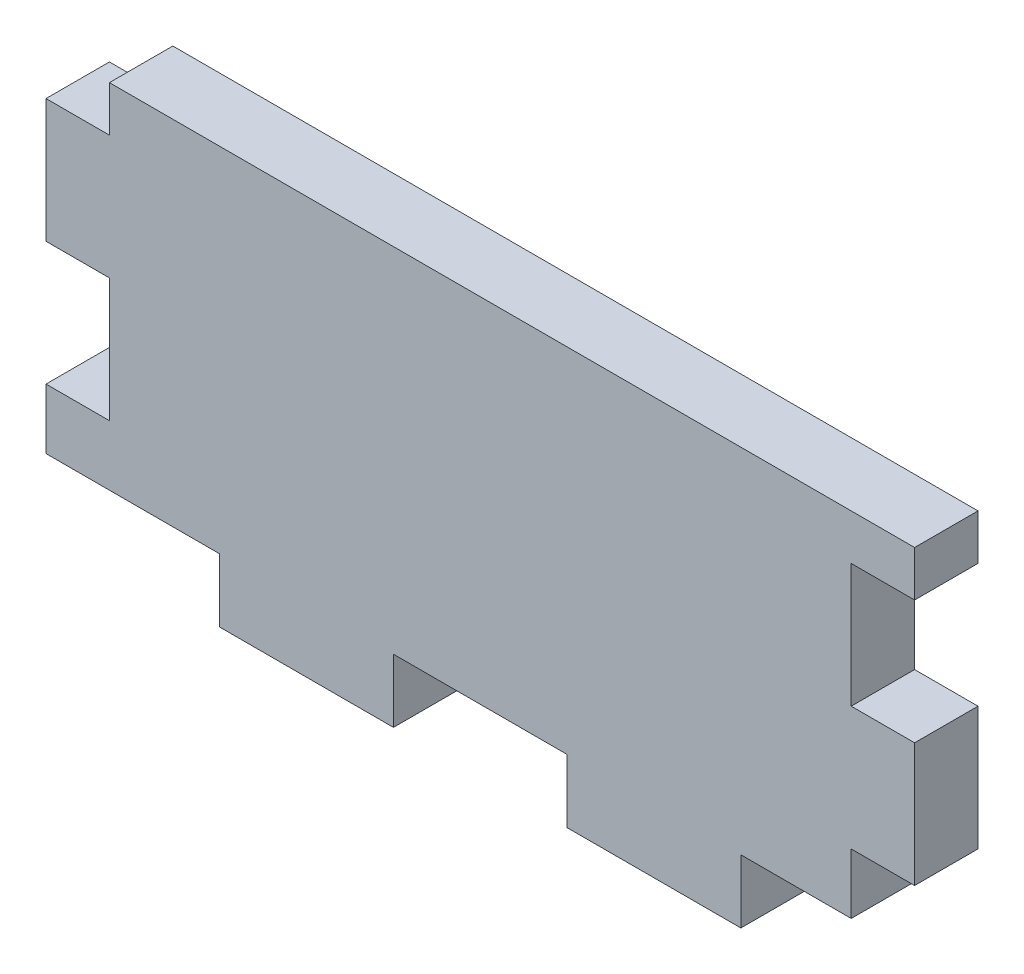
ISO-10303-21;
HEADER;
FILE_DESCRIPTION(('STEP AP214'),'2;1');
FILE_NAME('part.step','',(''),(''),'','','');
FILE_SCHEMA(('AUTOMOTIVE_DESIGN { 1 0 10303 214 1 1 1 1 }'));
ENDSEC;
DATA;
#1=APPLICATION_CONTEXT('core data for automotive mechanical design processes');
#2=APPLICATION_PROTOCOL_DEFINITION('international standard','automotive_design',2000,#1);
#3=PRODUCT_CONTEXT('',#1,'mechanical');
#4=PRODUCT('Part','Part','',(#3));
#5=PRODUCT_RELATED_PRODUCT_CATEGORY('part','',(#4));
#6=PRODUCT_DEFINITION_FORMATION('','',#4);
#7=PRODUCT_DEFINITION_CONTEXT('part definition',#1,'design');
#8=PRODUCT_DEFINITION('design','',#6,#7);
#9=PRODUCT_DEFINITION_SHAPE('','',#8);
#10=(LENGTH_UNIT() NAMED_UNIT(*) SI_UNIT(.MILLI.,.METRE.));
#11=(NAMED_UNIT(*) PLANE_ANGLE_UNIT() SI_UNIT($,.RADIAN.));
#12=(NAMED_UNIT(*) SI_UNIT($,.STERADIAN.) SOLID_ANGLE_UNIT());
#13=UNCERTAINTY_MEASURE_WITH_UNIT(LENGTH_MEASURE(1.E-05),#10,'distance_accuracy_value','');
#14=(GEOMETRIC_REPRESENTATION_CONTEXT(3) GLOBAL_UNCERTAINTY_ASSIGNED_CONTEXT((#13)) GLOBAL_UNIT_ASSIGNED_CONTEXT((#10,
#11,#12)) REPRESENTATION_CONTEXT('',''));
#15=CARTESIAN_POINT('',(0.,0.,0.));
#16=DIRECTION('',(0.,0.,1.));
#17=DIRECTION('',(1.,0.,0.));
#18=AXIS2_PLACEMENT_3D('',#15,#16,#17);
#19=CARTESIAN_POINT('',(0.,-26.67,4.5593));
#20=DIRECTION('',(0.,1.,0.));
#21=DIRECTION('',(-1.,0.,0.));
#22=AXIS2_PLACEMENT_3D('',#19,#20,#21);
#23=PLANE('',#22);
#24=DIRECTION('',(0.,0.,1.));
#25=VECTOR('',#24,1.);
#26=CARTESIAN_POINT('',(18.73758,-26.67,-26.67));
#27=LINE('',#26,#25);
#28=CARTESIAN_POINT('',(18.73758,-26.67,0.));
#29=VERTEX_POINT('',#28);
#30=CARTESIAN_POINT('',(18.73758,-26.67,4.55929999999996));
#31=VERTEX_POINT('',#30);
#32=EDGE_CURVE('E366',#29,#31,#27,.T.);
#33=ORIENTED_EDGE('',*,*,#32,.T.);
#34=DIRECTION('',(1.,0.,0.));
#35=VECTOR('',#34,1.);
#36=CARTESIAN_POINT('',(0.,-26.67,4.5593));
#37=LINE('',#36,#35);
#38=CARTESIAN_POINT('',(6.24586000000003,-26.67,4.55929999999997));
#39=VERTEX_POINT('',#38);
#40=EDGE_CURVE('E217',#39,#31,#37,.T.);
#41=ORIENTED_EDGE('',*,*,#40,.F.);
#42=DIRECTION('',(0.,0.,1.));
#43=VECTOR('',#42,1.);
#44=CARTESIAN_POINT('',(6.24586000000003,-26.67,-26.67));
#45=LINE('',#44,#43);
#46=CARTESIAN_POINT('',(6.24586000000003,-26.67,0.));
#47=VERTEX_POINT('',#46);
#48=EDGE_CURVE('E201',#47,#39,#45,.T.);
#49=ORIENTED_EDGE('',*,*,#48,.F.);
#50=DIRECTION('',(1.,0.,0.));
#51=VECTOR('',#50,1.);
#52=CARTESIAN_POINT('',(0.,-26.67,0.));
#53=LINE('',#52,#51);
#54=EDGE_CURVE('E288',#47,#29,#53,.T.);
#55=ORIENTED_EDGE('',*,*,#54,.T.);
#56=EDGE_LOOP('',(#33,#41,#49,#55));
#57=FACE_BOUND('',#56,.T.);
#58=ADVANCED_FACE('F34',(#57),#23,.F.);
#59=CARTESIAN_POINT('',(-18.73758,-26.67,4.55929999999997));
#60=VERTEX_POINT('',#59);
#61=CARTESIAN_POINT('',(-6.24585999999997,-26.67,4.55929999999997));
#62=VERTEX_POINT('',#61);
#63=EDGE_CURVE('E252',#60,#62,#37,.T.);
#64=ORIENTED_EDGE('',*,*,#63,.F.);
#65=DIRECTION('',(0.,0.,1.));
#66=VECTOR('',#65,1.);
#67=CARTESIAN_POINT('',(-18.73758,-26.67,-26.67));
#68=LINE('',#67,#66);
#69=CARTESIAN_POINT('',(-18.73758,-26.67,0.));
#70=VERTEX_POINT('',#69);
#71=EDGE_CURVE('E368',#70,#60,#68,.T.);
#72=ORIENTED_EDGE('',*,*,#71,.F.);
#73=CARTESIAN_POINT('',(-6.24585999999997,-26.67,0.));
#74=VERTEX_POINT('',#73);
#75=EDGE_CURVE('E291',#70,#74,#53,.T.);
#76=ORIENTED_EDGE('',*,*,#75,.T.);
#77=DIRECTION('',(0.,0.,1.));
#78=VECTOR('',#77,1.);
#79=CARTESIAN_POINT('',(-6.24585999999997,-26.67,-26.67));
#80=LINE('',#79,#78);
#81=EDGE_CURVE('E370',#74,#62,#80,.T.);
#82=ORIENTED_EDGE('',*,*,#81,.T.);
#83=EDGE_LOOP('',(#64,#72,#76,#82));
#84=FACE_BOUND('',#83,.T.);
#85=ADVANCED_FACE('F385',(#84),#23,.F.);
#86=CARTESIAN_POINT('',(0.,0.,4.5593));
#87=DIRECTION('',(0.,0.,1.));
#88=DIRECTION('',(1.,0.,0.));
#89=AXIS2_PLACEMENT_3D('',#86,#87,#88);
#90=PLANE('',#89);
#91=ORIENTED_EDGE('',*,*,#40,.T.);
#92=DIRECTION('',(0.,-1.,0.));
#93=VECTOR('',#92,1.);
#94=CARTESIAN_POINT('',(18.73758,-22.1107,4.55929999999996));
#95=LINE('',#94,#93);
#96=CARTESIAN_POINT('',(18.73758,-22.1107,4.55929999999996));
#97=VERTEX_POINT('',#96);
#98=EDGE_CURVE('E197',#97,#31,#95,.T.);
#99=ORIENTED_EDGE('',*,*,#98,.F.);
#100=DIRECTION('',(1.,0.,0.));
#101=VECTOR('',#100,1.);
#102=CARTESIAN_POINT('',(0.,-22.1107,4.55929999999997));
#103=LINE('',#102,#101);
#104=CARTESIAN_POINT('',(26.67,-22.1107,4.55929999999996));
#105=VERTEX_POINT('',#104);
#106=EDGE_CURVE('E200',#97,#105,#103,.T.);
#107=ORIENTED_EDGE('',*,*,#106,.T.);
#108=DIRECTION('',(0.,1.,0.));
#109=VECTOR('',#108,1.);
#110=CARTESIAN_POINT('',(26.6700000000001,0.,4.5593));
#111=LINE('',#110,#109);
#112=CARTESIAN_POINT('',(26.6700000000001,-17.78,4.5593));
#113=VERTEX_POINT('',#112);
#114=EDGE_CURVE('E253',#105,#113,#111,.T.);
#115=ORIENTED_EDGE('',*,*,#114,.T.);
#116=DIRECTION('',(-1.,0.,0.));
#117=VECTOR('',#116,1.);
#118=CARTESIAN_POINT('',(0.,-17.7800000000001,4.5593));
#119=LINE('',#118,#117);
#120=CARTESIAN_POINT('',(31.2293,-17.78,4.5593));
#121=VERTEX_POINT('',#120);
#122=EDGE_CURVE('E255',#121,#113,#119,.T.);
#123=ORIENTED_EDGE('',*,*,#122,.F.);
#124=DIRECTION('',(0.,1.,0.));
#125=VECTOR('',#124,1.);
#126=CARTESIAN_POINT('',(31.2293,0.,4.5593));
#127=LINE('',#126,#125);
#128=CARTESIAN_POINT('',(31.2293,-8.89000000000001,4.5593));
#129=VERTEX_POINT('',#128);
#130=EDGE_CURVE('E233',#121,#129,#127,.T.);
#131=ORIENTED_EDGE('',*,*,#130,.T.);
#132=DIRECTION('',(1.,0.,0.));
#133=VECTOR('',#132,1.);
#134=CARTESIAN_POINT('',(0.,-8.89000000000014,4.5593));
#135=LINE('',#134,#133);
#136=CARTESIAN_POINT('',(26.67,-8.89000000000002,4.5593));
#137=VERTEX_POINT('',#136);
#138=EDGE_CURVE('E258',#137,#129,#135,.T.);
#139=ORIENTED_EDGE('',*,*,#138,.F.);
#140=DIRECTION('',(0.,1.,0.));
#141=VECTOR('',#140,1.);
#142=CARTESIAN_POINT('',(26.67,1.76941794549637E-13,4.5593));
#143=LINE('',#142,#141);
#144=CARTESIAN_POINT('',(26.67,-1.84500891137916E-13,4.5593));
#145=VERTEX_POINT('',#144);
#146=EDGE_CURVE('E261',#137,#145,#143,.T.);
#147=ORIENTED_EDGE('',*,*,#146,.T.);
#148=DIRECTION('',(1.,0.,0.));
#149=VECTOR('',#148,1.);
#150=CARTESIAN_POINT('',(0.,-1.25479590885709E-12,4.5593));
#151=LINE('',#150,#149);
#152=CARTESIAN_POINT('',(31.2293,0.,4.5593));
#153=VERTEX_POINT('',#152);
#154=EDGE_CURVE('E263',#145,#153,#151,.T.);
#155=ORIENTED_EDGE('',*,*,#154,.T.);
#156=CARTESIAN_POINT('',(31.2293,3.27151999999999,4.5593));
#157=VERTEX_POINT('',#156);
#158=EDGE_CURVE('E228',#153,#157,#127,.T.);
#159=ORIENTED_EDGE('',*,*,#158,.T.);
#160=DIRECTION('',(-1.,0.,0.));
#161=VECTOR('',#160,1.);
#162=CARTESIAN_POINT('',(0.,3.27151999999999,4.5593));
#163=LINE('',#162,#161);
#164=CARTESIAN_POINT('',(-26.67,3.27151999999999,4.5593));
#165=VERTEX_POINT('',#164);
#166=EDGE_CURVE('E231',#157,#165,#163,.T.);
#167=ORIENTED_EDGE('',*,*,#166,.T.);
#168=DIRECTION('',(0.,-1.,0.));
#169=VECTOR('',#168,1.);
#170=CARTESIAN_POINT('',(-26.67,0.,4.5593));
#171=LINE('',#170,#169);
#172=CARTESIAN_POINT('',(-26.67,0.,4.5593));
#173=VERTEX_POINT('',#172);
#174=EDGE_CURVE('E235',#165,#173,#171,.T.);
#175=ORIENTED_EDGE('',*,*,#174,.T.);
#176=DIRECTION('',(-1.,0.,0.));
#177=VECTOR('',#176,1.);
#178=CARTESIAN_POINT('',(0.,0.,4.5593));
#179=LINE('',#178,#177);
#180=CARTESIAN_POINT('',(-31.2293,0.,4.5593));
#181=VERTEX_POINT('',#180);
#182=EDGE_CURVE('E237',#173,#181,#179,.T.);
#183=ORIENTED_EDGE('',*,*,#182,.T.);
#184=DIRECTION('',(0.,1.,0.));
#185=VECTOR('',#184,1.);
#186=CARTESIAN_POINT('',(-31.2293,0.,4.5593));
#187=LINE('',#186,#185);
#188=CARTESIAN_POINT('',(-31.2293,-8.89,4.5593));
#189=VERTEX_POINT('',#188);
#190=EDGE_CURVE('E239',#189,#181,#187,.T.);
#191=ORIENTED_EDGE('',*,*,#190,.F.);
#192=DIRECTION('',(-1.,0.,0.));
#193=VECTOR('',#192,1.);
#194=CARTESIAN_POINT('',(0.,-8.88999999999989,4.5593));
#195=LINE('',#194,#193);
#196=CARTESIAN_POINT('',(-26.67,-8.88999999999999,4.5593));
#197=VERTEX_POINT('',#196);
#198=EDGE_CURVE('E242',#197,#189,#195,.T.);
#199=ORIENTED_EDGE('',*,*,#198,.F.);
#200=DIRECTION('',(0.,-1.,0.));
#201=VECTOR('',#200,1.);
#202=CARTESIAN_POINT('',(-26.67,0.,4.5593));
#203=LINE('',#202,#201);
#204=CARTESIAN_POINT('',(-26.67,-17.78,4.5593));
#205=VERTEX_POINT('',#204);
#206=EDGE_CURVE('E246',#197,#205,#203,.T.);
#207=ORIENTED_EDGE('',*,*,#206,.T.);
#208=DIRECTION('',(-1.,0.,0.));
#209=VECTOR('',#208,1.);
#210=CARTESIAN_POINT('',(0.,-17.7799999999999,4.5593));
#211=LINE('',#210,#209);
#212=CARTESIAN_POINT('',(-31.2293,-17.78,4.5593));
#213=VERTEX_POINT('',#212);
#214=EDGE_CURVE('E248',#205,#213,#211,.T.);
#215=ORIENTED_EDGE('',*,*,#214,.T.);
#216=CARTESIAN_POINT('',(-31.2293,-22.1107,4.55929999999997));
#217=VERTEX_POINT('',#216);
#218=EDGE_CURVE('E243',#217,#213,#187,.T.);
#219=ORIENTED_EDGE('',*,*,#218,.F.);
#220=CARTESIAN_POINT('',(-18.73758,-22.1107,4.55929999999997));
#221=VERTEX_POINT('',#220);
#222=EDGE_CURVE('E212',#217,#221,#103,.T.);
#223=ORIENTED_EDGE('',*,*,#222,.T.);
#224=DIRECTION('',(0.,-1.,0.));
#225=VECTOR('',#224,1.);
#226=CARTESIAN_POINT('',(-18.73758,-22.1107,4.55929999999997));
#227=LINE('',#226,#225);
#228=EDGE_CURVE('E218',#221,#60,#227,.T.);
#229=ORIENTED_EDGE('',*,*,#228,.T.);
#230=ORIENTED_EDGE('',*,*,#63,.T.);
#231=DIRECTION('',(0.,-1.,0.));
#232=VECTOR('',#231,1.);
#233=CARTESIAN_POINT('',(-6.24585999999997,-22.1107,4.55929999999997));
#234=LINE('',#233,#232);
#235=CARTESIAN_POINT('',(-6.24585999999997,-22.1107,4.55929999999997));
#236=VERTEX_POINT('',#235);
#237=EDGE_CURVE('E375',#236,#62,#234,.T.);
#238=ORIENTED_EDGE('',*,*,#237,.F.);
#239=CARTESIAN_POINT('',(6.24586000000003,-22.1107,4.55929999999997));
#240=VERTEX_POINT('',#239);
#241=EDGE_CURVE('E211',#236,#240,#103,.T.);
#242=ORIENTED_EDGE('',*,*,#241,.T.);
#243=DIRECTION('',(0.,-1.,0.));
#244=VECTOR('',#243,1.);
#245=CARTESIAN_POINT('',(6.24586000000003,-22.1107,4.55929999999997));
#246=LINE('',#245,#244);
#247=EDGE_CURVE('E360',#240,#39,#246,.T.);
#248=ORIENTED_EDGE('',*,*,#247,.T.);
#249=EDGE_LOOP('',(#91,#99,#107,#115,#123,#131,#139,#147,#155,#159,#167,#175,#183,#191,#199,
#207,#215,#219,#223,#229,#230,#238,#242,#248));
#250=FACE_BOUND('',#249,.T.);
#251=ADVANCED_FACE('F214',(#250),#90,.T.);
#252=CARTESIAN_POINT('',(31.2293,0.,4.5593));
#253=DIRECTION('',(-1.,0.,0.));
#254=DIRECTION('',(0.,0.,1.));
#255=AXIS2_PLACEMENT_3D('',#252,#253,#254);
#256=PLANE('',#255);
#257=DIRECTION('',(0.,1.,0.));
#258=VECTOR('',#257,1.);
#259=CARTESIAN_POINT('',(31.2293,0.,0.));
#260=LINE('',#259,#258);
#261=CARTESIAN_POINT('',(31.2293,0.,0.));
#262=VERTEX_POINT('',#261);
#263=CARTESIAN_POINT('',(31.2293,3.27151999999999,0.));
#264=VERTEX_POINT('',#263);
#265=EDGE_CURVE('E227',#262,#264,#260,.T.);
#266=ORIENTED_EDGE('',*,*,#265,.T.);
#267=DIRECTION('',(0.,0.,-1.));
#268=VECTOR('',#267,1.);
#269=CARTESIAN_POINT('',(31.2293,3.27151999999999,4.5593));
#270=LINE('',#269,#268);
#271=EDGE_CURVE('E334',#157,#264,#270,.T.);
#272=ORIENTED_EDGE('',*,*,#271,.F.);
#273=ORIENTED_EDGE('',*,*,#158,.F.);
#274=DIRECTION('',(0.,0.,-1.));
#275=VECTOR('',#274,1.);
#276=CARTESIAN_POINT('',(31.2293,0.,4.5593));
#277=LINE('',#276,#275);
#278=EDGE_CURVE('E265',#153,#262,#277,.T.);
#279=ORIENTED_EDGE('',*,*,#278,.T.);
#280=EDGE_LOOP('',(#266,#272,#273,#279));
#281=FACE_BOUND('',#280,.T.);
#282=ADVANCED_FACE('F428',(#281),#256,.F.);
#283=CARTESIAN_POINT('',(0.,3.27151999999999,4.5593));
#284=DIRECTION('',(0.,-1.,0.));
#285=DIRECTION('',(1.,0.,0.));
#286=AXIS2_PLACEMENT_3D('',#283,#284,#285);
#287=PLANE('',#286);
#288=DIRECTION('',(-1.,0.,0.));
#289=VECTOR('',#288,1.);
#290=CARTESIAN_POINT('',(0.,3.27151999999999,0.));
#291=LINE('',#290,#289);
#292=CARTESIAN_POINT('',(-26.67,3.27151999999999,0.));
#293=VERTEX_POINT('',#292);
#294=EDGE_CURVE('E268',#264,#293,#291,.T.);
#295=ORIENTED_EDGE('',*,*,#294,.T.);
#296=DIRECTION('',(0.,0.,-1.));
#297=VECTOR('',#296,1.);
#298=CARTESIAN_POINT('',(-26.67,3.27151999999999,4.5593));
#299=LINE('',#298,#297);
#300=EDGE_CURVE('E332',#165,#293,#299,.T.);
#301=ORIENTED_EDGE('',*,*,#300,.F.);
#302=ORIENTED_EDGE('',*,*,#166,.F.);
#303=ORIENTED_EDGE('',*,*,#271,.T.);
#304=EDGE_LOOP('',(#295,#301,#302,#303));
#305=FACE_BOUND('',#304,.T.);
#306=ADVANCED_FACE('F36',(#305),#287,.F.);
#307=CARTESIAN_POINT('',(-26.67,0.,4.5593));
#308=DIRECTION('',(1.,0.,0.));
#309=DIRECTION('',(0.,1.,0.));
#310=AXIS2_PLACEMENT_3D('',#307,#308,#309);
#311=PLANE('',#310);
#312=DIRECTION('',(0.,-1.,0.));
#313=VECTOR('',#312,1.);
#314=CARTESIAN_POINT('',(-26.67,0.,0.));
#315=LINE('',#314,#313);
#316=CARTESIAN_POINT('',(-26.67,0.,0.));
#317=VERTEX_POINT('',#316);
#318=EDGE_CURVE('E271',#293,#317,#315,.T.);
#319=ORIENTED_EDGE('',*,*,#318,.T.);
#320=DIRECTION('',(0.,0.,-1.));
#321=VECTOR('',#320,1.);
#322=CARTESIAN_POINT('',(-26.67,0.,4.5593));
#323=LINE('',#322,#321);
#324=EDGE_CURVE('E329',#173,#317,#323,.T.);
#325=ORIENTED_EDGE('',*,*,#324,.F.);
#326=ORIENTED_EDGE('',*,*,#174,.F.);
#327=ORIENTED_EDGE('',*,*,#300,.T.);
#328=EDGE_LOOP('',(#319,#325,#326,#327));
#329=FACE_BOUND('',#328,.T.);
#330=ADVANCED_FACE('F422',(#329),#311,.F.);
#331=CARTESIAN_POINT('',(0.,0.,4.5593));
#332=DIRECTION('',(0.,-1.,0.));
#333=DIRECTION('',(1.,0.,0.));
#334=AXIS2_PLACEMENT_3D('',#331,#332,#333);
#335=PLANE('',#334);
#336=DIRECTION('',(-1.,0.,0.));
#337=VECTOR('',#336,1.);
#338=CARTESIAN_POINT('',(0.,0.,0.));
#339=LINE('',#338,#337);
#340=CARTESIAN_POINT('',(-31.2293,0.,0.));
#341=VERTEX_POINT('',#340);
#342=EDGE_CURVE('E273',#317,#341,#339,.T.);
#343=ORIENTED_EDGE('',*,*,#342,.T.);
#344=DIRECTION('',(0.,0.,-1.));
#345=VECTOR('',#344,1.);
#346=CARTESIAN_POINT('',(-31.2293,0.,4.5593));
#347=LINE('',#346,#345);
#348=EDGE_CURVE('E327',#181,#341,#347,.T.);
#349=ORIENTED_EDGE('',*,*,#348,.F.);
#350=ORIENTED_EDGE('',*,*,#182,.F.);
#351=ORIENTED_EDGE('',*,*,#324,.T.);
#352=EDGE_LOOP('',(#343,#349,#350,#351));
#353=FACE_BOUND('',#352,.T.);
#354=ADVANCED_FACE('F417',(#353),#335,.F.);
#355=CARTESIAN_POINT('',(-31.2293,0.,4.5593));
#356=DIRECTION('',(-1.,0.,0.));
#357=DIRECTION('',(0.,-1.,0.));
#358=AXIS2_PLACEMENT_3D('',#355,#356,#357);
#359=PLANE('',#358);
#360=DIRECTION('',(0.,1.,0.));
#361=VECTOR('',#360,1.);
#362=CARTESIAN_POINT('',(-31.2293,0.,0.));
#363=LINE('',#362,#361);
#364=CARTESIAN_POINT('',(-31.2293,-8.89,0.));
#365=VERTEX_POINT('',#364);
#366=EDGE_CURVE('E276',#365,#341,#363,.T.);
#367=ORIENTED_EDGE('',*,*,#366,.F.);
#368=DIRECTION('',(0.,0.,-1.));
#369=VECTOR('',#368,1.);
#370=CARTESIAN_POINT('',(-31.2293,-8.89,4.5593));
#371=LINE('',#370,#369);
#372=EDGE_CURVE('E325',#189,#365,#371,.T.);
#373=ORIENTED_EDGE('',*,*,#372,.F.);
#374=ORIENTED_EDGE('',*,*,#190,.T.);
#375=ORIENTED_EDGE('',*,*,#348,.T.);
#376=EDGE_LOOP('',(#367,#373,#374,#375));
#377=FACE_BOUND('',#376,.T.);
#378=ADVANCED_FACE('F412',(#377),#359,.T.);
#379=CARTESIAN_POINT('',(0.,-8.88999999999989,4.5593));
#380=DIRECTION('',(0.,-1.,0.));
#381=DIRECTION('',(1.,0.,0.));
#382=AXIS2_PLACEMENT_3D('',#379,#380,#381);
#383=PLANE('',#382);
#384=DIRECTION('',(-1.,0.,0.));
#385=VECTOR('',#384,1.);
#386=CARTESIAN_POINT('',(0.,-8.88999999999989,0.));
#387=LINE('',#386,#385);
#388=CARTESIAN_POINT('',(-26.67,-8.88999999999999,0.));
#389=VERTEX_POINT('',#388);
#390=EDGE_CURVE('E279',#389,#365,#387,.T.);
#391=ORIENTED_EDGE('',*,*,#390,.F.);
#392=DIRECTION('',(0.,0.,-1.));
#393=VECTOR('',#392,1.);
#394=CARTESIAN_POINT('',(-26.67,-8.88999999999999,4.5593));
#395=LINE('',#394,#393);
#396=EDGE_CURVE('E323',#197,#389,#395,.T.);
#397=ORIENTED_EDGE('',*,*,#396,.F.);
#398=ORIENTED_EDGE('',*,*,#198,.T.);
#399=ORIENTED_EDGE('',*,*,#372,.T.);
#400=EDGE_LOOP('',(#391,#397,#398,#399));
#401=FACE_BOUND('',#400,.T.);
#402=ADVANCED_FACE('F408',(#401),#383,.T.);
#403=CARTESIAN_POINT('',(-26.67,0.,4.5593));
#404=DIRECTION('',(1.,0.,0.));
#405=DIRECTION('',(0.,1.,0.));
#406=AXIS2_PLACEMENT_3D('',#403,#404,#405);
#407=PLANE('',#406);
#408=DIRECTION('',(0.,-1.,0.));
#409=VECTOR('',#408,1.);
#410=CARTESIAN_POINT('',(-26.67,0.,0.));
#411=LINE('',#410,#409);
#412=CARTESIAN_POINT('',(-26.67,-17.78,0.));
#413=VERTEX_POINT('',#412);
#414=EDGE_CURVE('E283',#389,#413,#411,.T.);
#415=ORIENTED_EDGE('',*,*,#414,.T.);
#416=DIRECTION('',(0.,0.,-1.));
#417=VECTOR('',#416,1.);
#418=CARTESIAN_POINT('',(-26.67,-17.78,4.5593));
#419=LINE('',#418,#417);
#420=EDGE_CURVE('E320',#205,#413,#419,.T.);
#421=ORIENTED_EDGE('',*,*,#420,.F.);
#422=ORIENTED_EDGE('',*,*,#206,.F.);
#423=ORIENTED_EDGE('',*,*,#396,.T.);
#424=EDGE_LOOP('',(#415,#421,#422,#423));
#425=FACE_BOUND('',#424,.T.);
#426=ADVANCED_FACE('F468',(#425),#407,.F.);
#427=CARTESIAN_POINT('',(0.,-17.7799999999999,4.5593));
#428=DIRECTION('',(0.,-1.,0.));
#429=DIRECTION('',(1.,0.,0.));
#430=AXIS2_PLACEMENT_3D('',#427,#428,#429);
#431=PLANE('',#430);
#432=DIRECTION('',(-1.,0.,0.));
#433=VECTOR('',#432,1.);
#434=CARTESIAN_POINT('',(0.,-17.7799999999999,0.));
#435=LINE('',#434,#433);
#436=CARTESIAN_POINT('',(-31.2293,-17.78,0.));
#437=VERTEX_POINT('',#436);
#438=EDGE_CURVE('E285',#413,#437,#435,.T.);
#439=ORIENTED_EDGE('',*,*,#438,.T.);
#440=DIRECTION('',(0.,0.,-1.));
#441=VECTOR('',#440,1.);
#442=CARTESIAN_POINT('',(-31.2293,-17.78,4.5593));
#443=LINE('',#442,#441);
#444=EDGE_CURVE('E317',#213,#437,#443,.T.);
#445=ORIENTED_EDGE('',*,*,#444,.F.);
#446=ORIENTED_EDGE('',*,*,#214,.F.);
#447=ORIENTED_EDGE('',*,*,#420,.T.);
#448=EDGE_LOOP('',(#439,#445,#446,#447));
#449=FACE_BOUND('',#448,.T.);
#450=ADVANCED_FACE('F402',(#449),#431,.F.);
#451=DIRECTION('',(0.,0.,-1.));
#452=VECTOR('',#451,1.);
#453=CARTESIAN_POINT('',(-31.2293,-22.1107,-26.67));
#454=LINE('',#453,#452);
#455=CARTESIAN_POINT('',(-31.2293,-22.1107,0.));
#456=VERTEX_POINT('',#455);
#457=EDGE_CURVE('E209',#217,#456,#454,.T.);
#458=ORIENTED_EDGE('',*,*,#457,.F.);
#459=ORIENTED_EDGE('',*,*,#218,.T.);
#460=ORIENTED_EDGE('',*,*,#444,.T.);
#461=EDGE_CURVE('E280',#456,#437,#363,.T.);
#462=ORIENTED_EDGE('',*,*,#461,.F.);
#463=EDGE_LOOP('',(#458,#459,#460,#462));
#464=FACE_BOUND('',#463,.T.);
#465=ADVANCED_FACE('F395',(#464),#359,.T.);
#466=CARTESIAN_POINT('',(26.6700000000001,0.,4.5593));
#467=DIRECTION('',(-1.,0.,0.));
#468=DIRECTION('',(0.,-1.,0.));
#469=AXIS2_PLACEMENT_3D('',#466,#467,#468);
#470=PLANE('',#469);
#471=ORIENTED_EDGE('',*,*,#114,.F.);
#472=DIRECTION('',(0.,0.,-1.));
#473=VECTOR('',#472,1.);
#474=CARTESIAN_POINT('',(26.67,-22.1107,4.5593));
#475=LINE('',#474,#473);
#476=CARTESIAN_POINT('',(26.67,-22.1107,0.));
#477=VERTEX_POINT('',#476);
#478=EDGE_CURVE('E206',#105,#477,#475,.T.);
#479=ORIENTED_EDGE('',*,*,#478,.T.);
#480=DIRECTION('',(0.,1.,0.));
#481=VECTOR('',#480,1.);
#482=CARTESIAN_POINT('',(26.6700000000001,0.,0.));
#483=LINE('',#482,#481);
#484=CARTESIAN_POINT('',(26.6700000000001,-17.78,0.));
#485=VERTEX_POINT('',#484);
#486=EDGE_CURVE('E292',#477,#485,#483,.T.);
#487=ORIENTED_EDGE('',*,*,#486,.T.);
#488=DIRECTION('',(0.,0.,-1.));
#489=VECTOR('',#488,1.);
#490=CARTESIAN_POINT('',(26.6700000000001,-17.78,4.5593));
#491=LINE('',#490,#489);
#492=EDGE_CURVE('E314',#113,#485,#491,.T.);
#493=ORIENTED_EDGE('',*,*,#492,.F.);
#494=EDGE_LOOP('',(#471,#479,#487,#493));
#495=FACE_BOUND('',#494,.T.);
#496=ADVANCED_FACE('F454',(#495),#470,.F.);
#497=CARTESIAN_POINT('',(0.,-17.7800000000001,4.5593));
#498=DIRECTION('',(0.,-1.,0.));
#499=DIRECTION('',(1.,0.,0.));
#500=AXIS2_PLACEMENT_3D('',#497,#498,#499);
#501=PLANE('',#500);
#502=DIRECTION('',(-1.,0.,0.));
#503=VECTOR('',#502,1.);
#504=CARTESIAN_POINT('',(0.,-17.7800000000001,0.));
#505=LINE('',#504,#503);
#506=CARTESIAN_POINT('',(31.2293,-17.78,0.));
#507=VERTEX_POINT('',#506);
#508=EDGE_CURVE('E294',#507,#485,#505,.T.);
#509=ORIENTED_EDGE('',*,*,#508,.F.);
#510=DIRECTION('',(0.,0.,-1.));
#511=VECTOR('',#510,1.);
#512=CARTESIAN_POINT('',(31.2293,-17.78,4.5593));
#513=LINE('',#512,#511);
#514=EDGE_CURVE('E312',#121,#507,#513,.T.);
#515=ORIENTED_EDGE('',*,*,#514,.F.);
#516=ORIENTED_EDGE('',*,*,#122,.T.);
#517=ORIENTED_EDGE('',*,*,#492,.T.);
#518=EDGE_LOOP('',(#509,#515,#516,#517));
#519=FACE_BOUND('',#518,.T.);
#520=ADVANCED_FACE('F450',(#519),#501,.T.);
#521=CARTESIAN_POINT('',(31.2293,-8.89000000000001,0.));
#522=VERTEX_POINT('',#521);
#523=EDGE_CURVE('E269',#507,#522,#260,.T.);
#524=ORIENTED_EDGE('',*,*,#523,.T.);
#525=DIRECTION('',(0.,0.,-1.));
#526=VECTOR('',#525,1.);
#527=CARTESIAN_POINT('',(31.2293,-8.89000000000001,4.5593));
#528=LINE('',#527,#526);
#529=EDGE_CURVE('E310',#129,#522,#528,.T.);
#530=ORIENTED_EDGE('',*,*,#529,.F.);
#531=ORIENTED_EDGE('',*,*,#130,.F.);
#532=ORIENTED_EDGE('',*,*,#514,.T.);
#533=EDGE_LOOP('',(#524,#530,#531,#532));
#534=FACE_BOUND('',#533,.T.);
#535=ADVANCED_FACE('F447',(#534),#256,.F.);
#536=CARTESIAN_POINT('',(0.,-8.89000000000014,4.5593));
#537=DIRECTION('',(0.,1.,0.));
#538=DIRECTION('',(-1.,0.,0.));
#539=AXIS2_PLACEMENT_3D('',#536,#537,#538);
#540=PLANE('',#539);
#541=DIRECTION('',(1.,0.,0.));
#542=VECTOR('',#541,1.);
#543=CARTESIAN_POINT('',(0.,-8.89000000000014,0.));
#544=LINE('',#543,#542);
#545=CARTESIAN_POINT('',(26.67,-8.89000000000002,0.));
#546=VERTEX_POINT('',#545);
#547=EDGE_CURVE('E297',#546,#522,#544,.T.);
#548=ORIENTED_EDGE('',*,*,#547,.F.);
#549=DIRECTION('',(0.,0.,-1.));
#550=VECTOR('',#549,1.);
#551=CARTESIAN_POINT('',(26.67,-8.89000000000002,4.5593));
#552=LINE('',#551,#550);
#553=EDGE_CURVE('E308',#137,#546,#552,.T.);
#554=ORIENTED_EDGE('',*,*,#553,.F.);
#555=ORIENTED_EDGE('',*,*,#138,.T.);
#556=ORIENTED_EDGE('',*,*,#529,.T.);
#557=EDGE_LOOP('',(#548,#554,#555,#556));
#558=FACE_BOUND('',#557,.T.);
#559=ADVANCED_FACE('F442',(#558),#540,.T.);
#560=CARTESIAN_POINT('',(26.67,1.76941794549637E-13,4.5593));
#561=DIRECTION('',(-1.,0.,0.));
#562=DIRECTION('',(0.,-1.,0.));
#563=AXIS2_PLACEMENT_3D('',#560,#561,#562);
#564=PLANE('',#563);
#565=DIRECTION('',(0.,1.,0.));
#566=VECTOR('',#565,1.);
#567=CARTESIAN_POINT('',(26.67,1.76941794549637E-13,0.));
#568=LINE('',#567,#566);
#569=CARTESIAN_POINT('',(26.67,-1.84500891137916E-13,0.));
#570=VERTEX_POINT('',#569);
#571=EDGE_CURVE('E300',#546,#570,#568,.T.);
#572=ORIENTED_EDGE('',*,*,#571,.T.);
#573=DIRECTION('',(0.,0.,-1.));
#574=VECTOR('',#573,1.);
#575=CARTESIAN_POINT('',(26.67,-1.84500891137916E-13,4.5593));
#576=LINE('',#575,#574);
#577=EDGE_CURVE('E305',#145,#570,#576,.T.);
#578=ORIENTED_EDGE('',*,*,#577,.F.);
#579=ORIENTED_EDGE('',*,*,#146,.F.);
#580=ORIENTED_EDGE('',*,*,#553,.T.);
#581=EDGE_LOOP('',(#572,#578,#579,#580));
#582=FACE_BOUND('',#581,.T.);
#583=ADVANCED_FACE('F437',(#582),#564,.F.);
#584=CARTESIAN_POINT('',(0.,-1.25479590885709E-12,4.5593));
#585=DIRECTION('',(0.,1.,0.));
#586=DIRECTION('',(-1.,0.,0.));
#587=AXIS2_PLACEMENT_3D('',#584,#585,#586);
#588=PLANE('',#587);
#589=DIRECTION('',(1.,0.,0.));
#590=VECTOR('',#589,1.);
#591=CARTESIAN_POINT('',(0.,-1.25479590885709E-12,0.));
#592=LINE('',#591,#590);
#593=EDGE_CURVE('E232',#570,#262,#592,.T.);
#594=ORIENTED_EDGE('',*,*,#593,.T.);
#595=ORIENTED_EDGE('',*,*,#278,.F.);
#596=ORIENTED_EDGE('',*,*,#154,.F.);
#597=ORIENTED_EDGE('',*,*,#577,.T.);
#598=EDGE_LOOP('',(#594,#595,#596,#597));
#599=FACE_BOUND('',#598,.T.);
#600=ADVANCED_FACE('F433',(#599),#588,.F.);
#601=CARTESIAN_POINT('',(0.,0.,0.));
#602=DIRECTION('',(0.,0.,1.));
#603=DIRECTION('',(1.,0.,0.));
#604=AXIS2_PLACEMENT_3D('',#601,#602,#603);
#605=PLANE('',#604);
#606=ORIENTED_EDGE('',*,*,#486,.F.);
#607=DIRECTION('',(-1.,0.,0.));
#608=VECTOR('',#607,1.);
#609=CARTESIAN_POINT('',(0.,-22.1107,0.));
#610=LINE('',#609,#608);
#611=CARTESIAN_POINT('',(18.73758,-22.1107,0.));
#612=VERTEX_POINT('',#611);
#613=EDGE_CURVE('E11',#477,#612,#610,.T.);
#614=ORIENTED_EDGE('',*,*,#613,.T.);
#615=DIRECTION('',(0.,-1.,0.));
#616=VECTOR('',#615,1.);
#617=CARTESIAN_POINT('',(18.73758,-22.1107,0.));
#618=LINE('',#617,#616);
#619=EDGE_CURVE('E50',#612,#29,#618,.T.);
#620=ORIENTED_EDGE('',*,*,#619,.T.);
#621=ORIENTED_EDGE('',*,*,#54,.F.);
#622=DIRECTION('',(0.,-1.,0.));
#623=VECTOR('',#622,1.);
#624=CARTESIAN_POINT('',(6.24586000000003,-22.1107,0.));
#625=LINE('',#624,#623);
#626=CARTESIAN_POINT('',(6.24586000000003,-22.1107,0.));
#627=VERTEX_POINT('',#626);
#628=EDGE_CURVE('E351',#627,#47,#625,.T.);
#629=ORIENTED_EDGE('',*,*,#628,.F.);
#630=CARTESIAN_POINT('',(-6.24585999999997,-22.1107,0.));
#631=VERTEX_POINT('',#630);
#632=EDGE_CURVE('E43',#627,#631,#610,.T.);
#633=ORIENTED_EDGE('',*,*,#632,.T.);
#634=DIRECTION('',(0.,-1.,0.));
#635=VECTOR('',#634,1.);
#636=CARTESIAN_POINT('',(-6.24585999999997,-22.1107,0.));
#637=LINE('',#636,#635);
#638=EDGE_CURVE('E348',#631,#74,#637,.T.);
#639=ORIENTED_EDGE('',*,*,#638,.T.);
#640=ORIENTED_EDGE('',*,*,#75,.F.);
#641=DIRECTION('',(0.,-1.,0.));
#642=VECTOR('',#641,1.);
#643=CARTESIAN_POINT('',(-18.73758,-22.1107,0.));
#644=LINE('',#643,#642);
#645=CARTESIAN_POINT('',(-18.73758,-22.1107,0.));
#646=VERTEX_POINT('',#645);
#647=EDGE_CURVE('E222',#646,#70,#644,.T.);
#648=ORIENTED_EDGE('',*,*,#647,.F.);
#649=EDGE_CURVE('E38',#646,#456,#610,.T.);
#650=ORIENTED_EDGE('',*,*,#649,.T.);
#651=ORIENTED_EDGE('',*,*,#461,.T.);
#652=ORIENTED_EDGE('',*,*,#438,.F.);
#653=ORIENTED_EDGE('',*,*,#414,.F.);
#654=ORIENTED_EDGE('',*,*,#390,.T.);
#655=ORIENTED_EDGE('',*,*,#366,.T.);
#656=ORIENTED_EDGE('',*,*,#342,.F.);
#657=ORIENTED_EDGE('',*,*,#318,.F.);
#658=ORIENTED_EDGE('',*,*,#294,.F.);
#659=ORIENTED_EDGE('',*,*,#265,.F.);
#660=ORIENTED_EDGE('',*,*,#593,.F.);
#661=ORIENTED_EDGE('',*,*,#571,.F.);
#662=ORIENTED_EDGE('',*,*,#547,.T.);
#663=ORIENTED_EDGE('',*,*,#523,.F.);
#664=ORIENTED_EDGE('',*,*,#508,.T.);
#665=EDGE_LOOP('',(#606,#614,#620,#621,#629,#633,#639,#640,#648,#650,#651,#652,#653,#654,#655,
#656,#657,#658,#659,#660,#661,#662,#663,#664));
#666=FACE_BOUND('',#665,.T.);
#667=ADVANCED_FACE('F346',(#666),#605,.F.);
#668=CARTESIAN_POINT('',(0.,-22.1107,-26.67));
#669=DIRECTION('',(0.,1.,0.));
#670=DIRECTION('',(0.,0.,1.));
#671=AXIS2_PLACEMENT_3D('',#668,#669,#670);
#672=PLANE('',#671);
#673=DIRECTION('',(0.,0.,1.));
#674=VECTOR('',#673,1.);
#675=CARTESIAN_POINT('',(-18.73758,-22.1107,-26.67));
#676=LINE('',#675,#674);
#677=EDGE_CURVE('E382',#646,#221,#676,.T.);
#678=ORIENTED_EDGE('',*,*,#677,.T.);
#679=ORIENTED_EDGE('',*,*,#222,.F.);
#680=ORIENTED_EDGE('',*,*,#457,.T.);
#681=ORIENTED_EDGE('',*,*,#649,.F.);
#682=EDGE_LOOP('',(#678,#679,#680,#681));
#683=FACE_BOUND('',#682,.T.);
#684=ADVANCED_FACE('F391',(#683),#672,.F.);
#685=CARTESIAN_POINT('',(-18.73758,-22.1107,-26.67));
#686=DIRECTION('',(1.,0.,0.));
#687=DIRECTION('',(0.,0.,-1.));
#688=AXIS2_PLACEMENT_3D('',#685,#686,#687);
#689=PLANE('',#688);
#690=ORIENTED_EDGE('',*,*,#71,.T.);
#691=ORIENTED_EDGE('',*,*,#228,.F.);
#692=ORIENTED_EDGE('',*,*,#677,.F.);
#693=ORIENTED_EDGE('',*,*,#647,.T.);
#694=EDGE_LOOP('',(#690,#691,#692,#693));
#695=FACE_BOUND('',#694,.T.);
#696=ADVANCED_FACE('F380',(#695),#689,.F.);
#697=DIRECTION('',(0.,0.,1.));
#698=VECTOR('',#697,1.);
#699=CARTESIAN_POINT('',(6.24586000000003,-22.1107,-26.67));
#700=LINE('',#699,#698);
#701=EDGE_CURVE('E355',#627,#240,#700,.T.);
#702=ORIENTED_EDGE('',*,*,#701,.T.);
#703=ORIENTED_EDGE('',*,*,#241,.F.);
#704=DIRECTION('',(0.,0.,1.));
#705=VECTOR('',#704,1.);
#706=CARTESIAN_POINT('',(-6.24585999999997,-22.1107,-26.67));
#707=LINE('',#706,#705);
#708=EDGE_CURVE('E58',#631,#236,#707,.T.);
#709=ORIENTED_EDGE('',*,*,#708,.F.);
#710=ORIENTED_EDGE('',*,*,#632,.F.);
#711=EDGE_LOOP('',(#702,#703,#709,#710));
#712=FACE_BOUND('',#711,.T.);
#713=ADVANCED_FACE('F354',(#712),#672,.F.);
#714=CARTESIAN_POINT('',(6.24586000000003,-22.1107,-26.67));
#715=DIRECTION('',(1.,0.,0.));
#716=DIRECTION('',(0.,0.,-1.));
#717=AXIS2_PLACEMENT_3D('',#714,#715,#716);
#718=PLANE('',#717);
#719=ORIENTED_EDGE('',*,*,#48,.T.);
#720=ORIENTED_EDGE('',*,*,#247,.F.);
#721=ORIENTED_EDGE('',*,*,#701,.F.);
#722=ORIENTED_EDGE('',*,*,#628,.T.);
#723=EDGE_LOOP('',(#719,#720,#721,#722));
#724=FACE_BOUND('',#723,.T.);
#725=ADVANCED_FACE('F358',(#724),#718,.F.);
#726=CARTESIAN_POINT('',(-6.24585999999997,-22.1107,-26.67));
#727=DIRECTION('',(1.,0.,0.));
#728=DIRECTION('',(0.,0.,-1.));
#729=AXIS2_PLACEMENT_3D('',#726,#727,#728);
#730=PLANE('',#729);
#731=ORIENTED_EDGE('',*,*,#81,.F.);
#732=ORIENTED_EDGE('',*,*,#638,.F.);
#733=ORIENTED_EDGE('',*,*,#708,.T.);
#734=ORIENTED_EDGE('',*,*,#237,.T.);
#735=EDGE_LOOP('',(#731,#732,#733,#734));
#736=FACE_BOUND('',#735,.T.);
#737=ADVANCED_FACE('F624',(#736),#730,.T.);
#738=ORIENTED_EDGE('',*,*,#106,.F.);
#739=DIRECTION('',(0.,0.,1.));
#740=VECTOR('',#739,1.);
#741=CARTESIAN_POINT('',(18.73758,-22.1107,-26.67));
#742=LINE('',#741,#740);
#743=EDGE_CURVE('E193',#612,#97,#742,.T.);
#744=ORIENTED_EDGE('',*,*,#743,.F.);
#745=ORIENTED_EDGE('',*,*,#613,.F.);
#746=ORIENTED_EDGE('',*,*,#478,.F.);
#747=EDGE_LOOP('',(#738,#744,#745,#746));
#748=FACE_BOUND('',#747,.T.);
#749=ADVANCED_FACE('F204',(#748),#672,.F.);
#750=CARTESIAN_POINT('',(18.73758,-22.1107,-26.67));
#751=DIRECTION('',(1.,0.,0.));
#752=DIRECTION('',(0.,0.,-1.));
#753=AXIS2_PLACEMENT_3D('',#750,#751,#752);
#754=PLANE('',#753);
#755=ORIENTED_EDGE('',*,*,#32,.F.);
#756=ORIENTED_EDGE('',*,*,#619,.F.);
#757=ORIENTED_EDGE('',*,*,#743,.T.);
#758=ORIENTED_EDGE('',*,*,#98,.T.);
#759=EDGE_LOOP('',(#755,#756,#757,#758));
#760=FACE_BOUND('',#759,.T.);
#761=ADVANCED_FACE('F195',(#760),#754,.T.);
#762=CLOSED_SHELL('',(#58,#85,#251,#282,#306,#330,#354,#378,#402,#426,#450,#465,#496,#520,#535,
#559,#583,#600,#667,#684,#696,#713,#725,#737,#749,#761));
#763=MANIFOLD_SOLID_BREP('B2',#762);
#764=ADVANCED_BREP_SHAPE_REPRESENTATION('',(#18,#763),#14);
#765=SHAPE_DEFINITION_REPRESENTATION(#9,#764);
ENDSEC;
END-ISO-10303-21;
